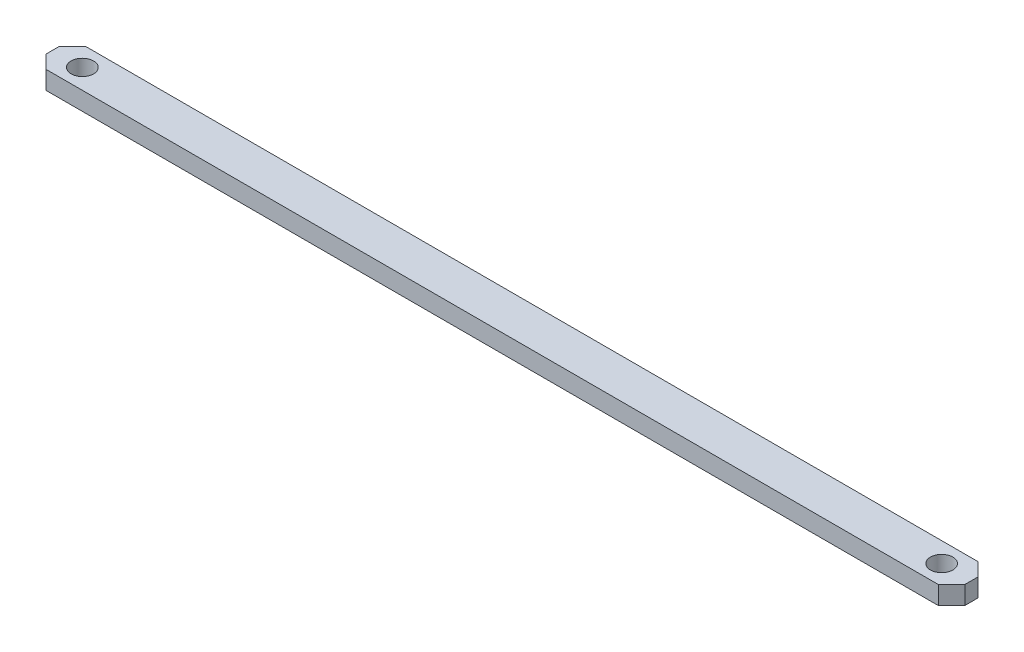
ISO-10303-21;
HEADER;
FILE_DESCRIPTION(('STEP AP214'),'2;1');
FILE_NAME('part.step','',(''),(''),'','','');
FILE_SCHEMA(('AUTOMOTIVE_DESIGN { 1 0 10303 214 1 1 1 1 }'));
ENDSEC;
DATA;
#1=APPLICATION_CONTEXT('core data for automotive mechanical design processes');
#2=APPLICATION_PROTOCOL_DEFINITION('international standard','automotive_design',2000,#1);
#3=PRODUCT_CONTEXT('',#1,'mechanical');
#4=PRODUCT('Part','Part','',(#3));
#5=PRODUCT_RELATED_PRODUCT_CATEGORY('part','',(#4));
#6=PRODUCT_DEFINITION_FORMATION('','',#4);
#7=PRODUCT_DEFINITION_CONTEXT('part definition',#1,'design');
#8=PRODUCT_DEFINITION('design','',#6,#7);
#9=PRODUCT_DEFINITION_SHAPE('','',#8);
#10=(LENGTH_UNIT() NAMED_UNIT(*) SI_UNIT(.MILLI.,.METRE.));
#11=(NAMED_UNIT(*) PLANE_ANGLE_UNIT() SI_UNIT($,.RADIAN.));
#12=(NAMED_UNIT(*) SI_UNIT($,.STERADIAN.) SOLID_ANGLE_UNIT());
#13=UNCERTAINTY_MEASURE_WITH_UNIT(LENGTH_MEASURE(1.E-05),#10,'distance_accuracy_value','');
#14=(GEOMETRIC_REPRESENTATION_CONTEXT(3) GLOBAL_UNCERTAINTY_ASSIGNED_CONTEXT((#13)) GLOBAL_UNIT_ASSIGNED_CONTEXT((#10,
#11,#12)) REPRESENTATION_CONTEXT('',''));
#15=CARTESIAN_POINT('',(0.,0.,0.));
#16=DIRECTION('',(0.,0.,1.));
#17=DIRECTION('',(1.,0.,0.));
#18=AXIS2_PLACEMENT_3D('',#15,#16,#17);
#19=CARTESIAN_POINT('',(69.5,1.38,-3.));
#20=DIRECTION('',(-1.,0.,0.));
#21=DIRECTION('',(0.,0.,1.));
#22=AXIS2_PLACEMENT_3D('',#19,#20,#21);
#23=PLANE('',#22);
#24=DIRECTION('',(0.,0.,-1.));
#25=VECTOR('',#24,1.);
#26=CARTESIAN_POINT('',(69.5,-1.38,-3.));
#27=LINE('',#26,#25);
#28=CARTESIAN_POINT('',(69.5,-1.38,0.999999999999971));
#29=VERTEX_POINT('',#28);
#30=CARTESIAN_POINT('',(69.5,-1.38,-0.999999999999998));
#31=VERTEX_POINT('',#30);
#32=EDGE_CURVE('E168',#29,#31,#27,.T.);
#33=ORIENTED_EDGE('',*,*,#32,.T.);
#34=DIRECTION('',(0.,1.,0.));
#35=VECTOR('',#34,1.);
#36=CARTESIAN_POINT('',(69.5,1.38,-0.999999999999998));
#37=LINE('',#36,#35);
#38=CARTESIAN_POINT('',(69.5,1.38,-0.999999999999998));
#39=VERTEX_POINT('',#38);
#40=EDGE_CURVE('E11',#31,#39,#37,.T.);
#41=ORIENTED_EDGE('',*,*,#40,.T.);
#42=DIRECTION('',(0.,0.,-1.));
#43=VECTOR('',#42,1.);
#44=CARTESIAN_POINT('',(69.5,1.38,-3.));
#45=LINE('',#44,#43);
#46=CARTESIAN_POINT('',(69.5,1.38,0.999999999999971));
#47=VERTEX_POINT('',#46);
#48=EDGE_CURVE('E136',#47,#39,#45,.T.);
#49=ORIENTED_EDGE('',*,*,#48,.F.);
#50=DIRECTION('',(0.,-1.,0.));
#51=VECTOR('',#50,1.);
#52=CARTESIAN_POINT('',(69.5,1.38,0.999999999999971));
#53=LINE('',#52,#51);
#54=EDGE_CURVE('E52',#47,#29,#53,.T.);
#55=ORIENTED_EDGE('',*,*,#54,.T.);
#56=EDGE_LOOP('',(#33,#41,#49,#55));
#57=FACE_BOUND('',#56,.T.);
#58=ADVANCED_FACE('F43',(#57),#23,.F.);
#59=CARTESIAN_POINT('',(-69.5,1.38,-3.));
#60=DIRECTION('',(0.,0.,1.));
#61=DIRECTION('',(1.,0.,0.));
#62=AXIS2_PLACEMENT_3D('',#59,#60,#61);
#63=PLANE('',#62);
#64=DIRECTION('',(-1.,0.,0.));
#65=VECTOR('',#64,1.);
#66=CARTESIAN_POINT('',(-69.5,-1.38,-3.));
#67=LINE('',#66,#65);
#68=CARTESIAN_POINT('',(67.5,-1.38,-3.));
#69=VERTEX_POINT('',#68);
#70=CARTESIAN_POINT('',(-67.4999999999999,-1.38,-3.));
#71=VERTEX_POINT('',#70);
#72=EDGE_CURVE('E141',#69,#71,#67,.T.);
#73=ORIENTED_EDGE('',*,*,#72,.T.);
#74=DIRECTION('',(0.,1.,0.));
#75=VECTOR('',#74,1.);
#76=CARTESIAN_POINT('',(-67.4999999999999,1.38,-3.));
#77=LINE('',#76,#75);
#78=CARTESIAN_POINT('',(-67.4999999999999,1.38,-3.));
#79=VERTEX_POINT('',#78);
#80=EDGE_CURVE('E59',#71,#79,#77,.T.);
#81=ORIENTED_EDGE('',*,*,#80,.T.);
#82=DIRECTION('',(-1.,0.,0.));
#83=VECTOR('',#82,1.);
#84=CARTESIAN_POINT('',(-69.5,1.38,-3.));
#85=LINE('',#84,#83);
#86=CARTESIAN_POINT('',(67.5,1.38,-3.));
#87=VERTEX_POINT('',#86);
#88=EDGE_CURVE('E139',#87,#79,#85,.T.);
#89=ORIENTED_EDGE('',*,*,#88,.F.);
#90=DIRECTION('',(0.,-1.,0.));
#91=VECTOR('',#90,1.);
#92=CARTESIAN_POINT('',(67.5,1.38,-3.));
#93=LINE('',#92,#91);
#94=EDGE_CURVE('E160',#87,#69,#93,.T.);
#95=ORIENTED_EDGE('',*,*,#94,.T.);
#96=EDGE_LOOP('',(#73,#81,#89,#95));
#97=FACE_BOUND('',#96,.T.);
#98=ADVANCED_FACE('F209',(#97),#63,.F.);
#99=CARTESIAN_POINT('',(-69.5,1.38,-3.));
#100=DIRECTION('',(1.,0.,0.));
#101=DIRECTION('',(0.,0.,-1.));
#102=AXIS2_PLACEMENT_3D('',#99,#100,#101);
#103=PLANE('',#102);
#104=DIRECTION('',(0.,0.,1.));
#105=VECTOR('',#104,1.);
#106=CARTESIAN_POINT('',(-69.5,-1.38,-3.));
#107=LINE('',#106,#105);
#108=CARTESIAN_POINT('',(-69.5,-1.38,-0.99999999999997));
#109=VERTEX_POINT('',#108);
#110=CARTESIAN_POINT('',(-69.5,-1.38,0.999999999999985));
#111=VERTEX_POINT('',#110);
#112=EDGE_CURVE('E137',#109,#111,#107,.T.);
#113=ORIENTED_EDGE('',*,*,#112,.T.);
#114=DIRECTION('',(0.,1.,0.));
#115=VECTOR('',#114,1.);
#116=CARTESIAN_POINT('',(-69.5,1.38,0.999999999999985));
#117=LINE('',#116,#115);
#118=CARTESIAN_POINT('',(-69.5,1.38,0.999999999999985));
#119=VERTEX_POINT('',#118);
#120=EDGE_CURVE('E115',#111,#119,#117,.T.);
#121=ORIENTED_EDGE('',*,*,#120,.T.);
#122=DIRECTION('',(0.,0.,1.));
#123=VECTOR('',#122,1.);
#124=CARTESIAN_POINT('',(-69.5,1.38,-3.));
#125=LINE('',#124,#123);
#126=CARTESIAN_POINT('',(-69.5,1.38,-0.99999999999997));
#127=VERTEX_POINT('',#126);
#128=EDGE_CURVE('E180',#127,#119,#125,.T.);
#129=ORIENTED_EDGE('',*,*,#128,.F.);
#130=DIRECTION('',(0.,-1.,0.));
#131=VECTOR('',#130,1.);
#132=CARTESIAN_POINT('',(-69.5,1.38,-0.99999999999997));
#133=LINE('',#132,#131);
#134=EDGE_CURVE('E120',#127,#109,#133,.T.);
#135=ORIENTED_EDGE('',*,*,#134,.T.);
#136=EDGE_LOOP('',(#113,#121,#129,#135));
#137=FACE_BOUND('',#136,.T.);
#138=ADVANCED_FACE('F214',(#137),#103,.F.);
#139=CARTESIAN_POINT('',(-69.5,1.38,3.));
#140=DIRECTION('',(0.,0.,-1.));
#141=DIRECTION('',(-1.,0.,0.));
#142=AXIS2_PLACEMENT_3D('',#139,#140,#141);
#143=PLANE('',#142);
#144=DIRECTION('',(1.,0.,0.));
#145=VECTOR('',#144,1.);
#146=CARTESIAN_POINT('',(-69.5,1.38,3.));
#147=LINE('',#146,#145);
#148=CARTESIAN_POINT('',(-67.5,1.38,3.));
#149=VERTEX_POINT('',#148);
#150=CARTESIAN_POINT('',(67.5,1.38,3.));
#151=VERTEX_POINT('',#150);
#152=EDGE_CURVE('E130',#149,#151,#147,.T.);
#153=ORIENTED_EDGE('',*,*,#152,.F.);
#154=DIRECTION('',(0.,-1.,0.));
#155=VECTOR('',#154,1.);
#156=CARTESIAN_POINT('',(-67.5,1.38,3.));
#157=LINE('',#156,#155);
#158=CARTESIAN_POINT('',(-67.5,-1.38,3.));
#159=VERTEX_POINT('',#158);
#160=EDGE_CURVE('E114',#149,#159,#157,.T.);
#161=ORIENTED_EDGE('',*,*,#160,.T.);
#162=DIRECTION('',(1.,0.,0.));
#163=VECTOR('',#162,1.);
#164=CARTESIAN_POINT('',(-69.5,-1.38,3.));
#165=LINE('',#164,#163);
#166=CARTESIAN_POINT('',(67.5,-1.38,3.));
#167=VERTEX_POINT('',#166);
#168=EDGE_CURVE('E127',#159,#167,#165,.T.);
#169=ORIENTED_EDGE('',*,*,#168,.T.);
#170=DIRECTION('',(0.,1.,0.));
#171=VECTOR('',#170,1.);
#172=CARTESIAN_POINT('',(67.5,1.38,3.));
#173=LINE('',#172,#171);
#174=EDGE_CURVE('E132',#167,#151,#173,.T.);
#175=ORIENTED_EDGE('',*,*,#174,.T.);
#176=EDGE_LOOP('',(#153,#161,#169,#175));
#177=FACE_BOUND('',#176,.T.);
#178=ADVANCED_FACE('F126',(#177),#143,.F.);
#179=CARTESIAN_POINT('',(0.,1.38,0.));
#180=DIRECTION('',(0.,1.,0.));
#181=DIRECTION('',(0.,0.,1.));
#182=AXIS2_PLACEMENT_3D('',#179,#180,#181);
#183=PLANE('',#182);
#184=CARTESIAN_POINT('',(65.,1.38,0.));
#185=DIRECTION('',(0.,1.,0.));
#186=DIRECTION('',(0.,0.,1.));
#187=AXIS2_PLACEMENT_3D('',#184,#185,#186);
#188=CIRCLE('',#187,1.7);
#189=CARTESIAN_POINT('',(65.,1.38,1.7));
#190=VERTEX_POINT('',#189);
#191=EDGE_CURVE('E173',#190,#190,#188,.T.);
#192=ORIENTED_EDGE('',*,*,#191,.F.);
#193=EDGE_LOOP('',(#192));
#194=FACE_BOUND('',#193,.T.);
#195=CARTESIAN_POINT('',(-65.,1.38,0.));
#196=DIRECTION('',(0.,1.,0.));
#197=DIRECTION('',(0.,0.,1.));
#198=AXIS2_PLACEMENT_3D('',#195,#196,#197);
#199=CIRCLE('',#198,1.7);
#200=CARTESIAN_POINT('',(-65.,1.38,1.7));
#201=VERTEX_POINT('',#200);
#202=EDGE_CURVE('E176',#201,#201,#199,.T.);
#203=ORIENTED_EDGE('',*,*,#202,.F.);
#204=EDGE_LOOP('',(#203));
#205=FACE_BOUND('',#204,.T.);
#206=ORIENTED_EDGE('',*,*,#128,.T.);
#207=DIRECTION('',(-0.707106781186545,0.,-0.70710678118655));
#208=VECTOR('',#207,1.);
#209=CARTESIAN_POINT('',(-35.2500000000002,1.38,35.25));
#210=LINE('',#209,#208);
#211=EDGE_CURVE('E158',#119,#149,#210,.F.);
#212=ORIENTED_EDGE('',*,*,#211,.T.);
#213=ORIENTED_EDGE('',*,*,#152,.T.);
#214=DIRECTION('',(-0.707106781186552,0.,0.707106781186543));
#215=VECTOR('',#214,1.);
#216=CARTESIAN_POINT('',(35.2499999999995,1.38,35.25));
#217=LINE('',#216,#215);
#218=EDGE_CURVE('E153',#151,#47,#217,.F.);
#219=ORIENTED_EDGE('',*,*,#218,.T.);
#220=ORIENTED_EDGE('',*,*,#48,.T.);
#221=DIRECTION('',(0.707106781186543,0.,0.707106781186552));
#222=VECTOR('',#221,1.);
#223=CARTESIAN_POINT('',(35.2500000000005,1.38,-35.25));
#224=LINE('',#223,#222);
#225=EDGE_CURVE('E66',#39,#87,#224,.F.);
#226=ORIENTED_EDGE('',*,*,#225,.T.);
#227=ORIENTED_EDGE('',*,*,#88,.T.);
#228=DIRECTION('',(0.70710678118655,0.,-0.707106781186545));
#229=VECTOR('',#228,1.);
#230=CARTESIAN_POINT('',(-35.2499999999997,1.38,-35.25));
#231=LINE('',#230,#229);
#232=EDGE_CURVE('E156',#79,#127,#231,.F.);
#233=ORIENTED_EDGE('',*,*,#232,.T.);
#234=EDGE_LOOP('',(#206,#212,#213,#219,#220,#226,#227,#233));
#235=FACE_BOUND('',#234,.T.);
#236=ADVANCED_FACE('F240',(#194,#205,#235),#183,.T.);
#237=CARTESIAN_POINT('',(0.,-1.38,0.));
#238=DIRECTION('',(0.,1.,0.));
#239=DIRECTION('',(0.,0.,1.));
#240=AXIS2_PLACEMENT_3D('',#237,#238,#239);
#241=PLANE('',#240);
#242=CARTESIAN_POINT('',(65.,-1.38,0.));
#243=DIRECTION('',(0.,1.,0.));
#244=DIRECTION('',(0.,0.,1.));
#245=AXIS2_PLACEMENT_3D('',#242,#243,#244);
#246=CIRCLE('',#245,1.7);
#247=CARTESIAN_POINT('',(65.,-1.38,1.7));
#248=VERTEX_POINT('',#247);
#249=EDGE_CURVE('E186',#248,#248,#246,.T.);
#250=ORIENTED_EDGE('',*,*,#249,.T.);
#251=EDGE_LOOP('',(#250));
#252=FACE_BOUND('',#251,.T.);
#253=CARTESIAN_POINT('',(-65.,-1.38,0.));
#254=DIRECTION('',(0.,1.,0.));
#255=DIRECTION('',(0.,0.,-1.));
#256=AXIS2_PLACEMENT_3D('',#253,#254,#255);
#257=CIRCLE('',#256,1.7);
#258=CARTESIAN_POINT('',(-65.,-1.38,-1.7));
#259=VERTEX_POINT('',#258);
#260=EDGE_CURVE('E187',#259,#259,#257,.T.);
#261=ORIENTED_EDGE('',*,*,#260,.T.);
#262=EDGE_LOOP('',(#261));
#263=FACE_BOUND('',#262,.T.);
#264=ORIENTED_EDGE('',*,*,#168,.F.);
#265=DIRECTION('',(0.707106781186545,0.,0.70710678118655));
#266=VECTOR('',#265,1.);
#267=CARTESIAN_POINT('',(-67.5,-1.38,3.));
#268=LINE('',#267,#266);
#269=EDGE_CURVE('E110',#159,#111,#268,.F.);
#270=ORIENTED_EDGE('',*,*,#269,.T.);
#271=ORIENTED_EDGE('',*,*,#112,.F.);
#272=DIRECTION('',(-0.70710678118655,0.,0.707106781186545));
#273=VECTOR('',#272,1.);
#274=CARTESIAN_POINT('',(-69.5,-1.38,-0.99999999999997));
#275=LINE('',#274,#273);
#276=EDGE_CURVE('E121',#109,#71,#275,.F.);
#277=ORIENTED_EDGE('',*,*,#276,.T.);
#278=ORIENTED_EDGE('',*,*,#72,.F.);
#279=DIRECTION('',(-0.707106781186543,0.,-0.707106781186552));
#280=VECTOR('',#279,1.);
#281=CARTESIAN_POINT('',(67.5,-1.38,-3.));
#282=LINE('',#281,#280);
#283=EDGE_CURVE('E147',#69,#31,#282,.F.);
#284=ORIENTED_EDGE('',*,*,#283,.T.);
#285=ORIENTED_EDGE('',*,*,#32,.F.);
#286=DIRECTION('',(0.707106781186552,0.,-0.707106781186543));
#287=VECTOR('',#286,1.);
#288=CARTESIAN_POINT('',(69.5,-1.38,0.999999999999971));
#289=LINE('',#288,#287);
#290=EDGE_CURVE('E131',#29,#167,#289,.F.);
#291=ORIENTED_EDGE('',*,*,#290,.T.);
#292=EDGE_LOOP('',(#264,#270,#271,#277,#278,#284,#285,#291));
#293=FACE_BOUND('',#292,.T.);
#294=ADVANCED_FACE('F134',(#252,#263,#293),#241,.F.);
#295=CARTESIAN_POINT('',(-65.,-1.38,0.));
#296=DIRECTION('',(0.,1.,0.));
#297=DIRECTION('',(0.,0.,1.));
#298=AXIS2_PLACEMENT_3D('',#295,#296,#297);
#299=CYLINDRICAL_SURFACE('',#298,1.7);
#300=ORIENTED_EDGE('',*,*,#202,.T.);
#301=EDGE_LOOP('',(#300));
#302=FACE_BOUND('',#301,.T.);
#303=ORIENTED_EDGE('',*,*,#260,.F.);
#304=EDGE_LOOP('',(#303));
#305=FACE_BOUND('',#304,.T.);
#306=ADVANCED_FACE('F197',(#302,#305),#299,.F.);
#307=CARTESIAN_POINT('',(65.,-1.38,0.));
#308=DIRECTION('',(0.,1.,0.));
#309=DIRECTION('',(0.,0.,1.));
#310=AXIS2_PLACEMENT_3D('',#307,#308,#309);
#311=CYLINDRICAL_SURFACE('',#310,1.7);
#312=ORIENTED_EDGE('',*,*,#191,.T.);
#313=EDGE_LOOP('',(#312));
#314=FACE_BOUND('',#313,.T.);
#315=ORIENTED_EDGE('',*,*,#249,.F.);
#316=EDGE_LOOP('',(#315));
#317=FACE_BOUND('',#316,.T.);
#318=ADVANCED_FACE('F195',(#314,#317),#311,.F.);
#319=CARTESIAN_POINT('',(-67.5,1.38,3.));
#320=DIRECTION('',(0.70710678118655,0.,-0.707106781186545));
#321=DIRECTION('',(0.,-1.,0.));
#322=AXIS2_PLACEMENT_3D('',#319,#320,#321);
#323=PLANE('',#322);
#324=ORIENTED_EDGE('',*,*,#211,.F.);
#325=ORIENTED_EDGE('',*,*,#120,.F.);
#326=ORIENTED_EDGE('',*,*,#269,.F.);
#327=ORIENTED_EDGE('',*,*,#160,.F.);
#328=EDGE_LOOP('',(#324,#325,#326,#327));
#329=FACE_BOUND('',#328,.T.);
#330=ADVANCED_FACE('F113',(#329),#323,.F.);
#331=CARTESIAN_POINT('',(-69.5,1.38,-0.99999999999997));
#332=DIRECTION('',(0.707106781186545,0.,0.70710678118655));
#333=DIRECTION('',(0.,-1.,0.));
#334=AXIS2_PLACEMENT_3D('',#331,#332,#333);
#335=PLANE('',#334);
#336=ORIENTED_EDGE('',*,*,#232,.F.);
#337=ORIENTED_EDGE('',*,*,#80,.F.);
#338=ORIENTED_EDGE('',*,*,#276,.F.);
#339=ORIENTED_EDGE('',*,*,#134,.F.);
#340=EDGE_LOOP('',(#336,#337,#338,#339));
#341=FACE_BOUND('',#340,.T.);
#342=ADVANCED_FACE('F204',(#341),#335,.F.);
#343=CARTESIAN_POINT('',(67.5,1.38,-3.));
#344=DIRECTION('',(-0.707106781186552,0.,0.707106781186543));
#345=DIRECTION('',(0.,-1.,0.));
#346=AXIS2_PLACEMENT_3D('',#343,#344,#345);
#347=PLANE('',#346);
#348=ORIENTED_EDGE('',*,*,#225,.F.);
#349=ORIENTED_EDGE('',*,*,#40,.F.);
#350=ORIENTED_EDGE('',*,*,#283,.F.);
#351=ORIENTED_EDGE('',*,*,#94,.F.);
#352=EDGE_LOOP('',(#348,#349,#350,#351));
#353=FACE_BOUND('',#352,.T.);
#354=ADVANCED_FACE('F226',(#353),#347,.F.);
#355=CARTESIAN_POINT('',(69.5,1.38,0.999999999999971));
#356=DIRECTION('',(-0.707106781186543,0.,-0.707106781186552));
#357=DIRECTION('',(0.,-1.,0.));
#358=AXIS2_PLACEMENT_3D('',#355,#356,#357);
#359=PLANE('',#358);
#360=ORIENTED_EDGE('',*,*,#218,.F.);
#361=ORIENTED_EDGE('',*,*,#174,.F.);
#362=ORIENTED_EDGE('',*,*,#290,.F.);
#363=ORIENTED_EDGE('',*,*,#54,.F.);
#364=EDGE_LOOP('',(#360,#361,#362,#363));
#365=FACE_BOUND('',#364,.T.);
#366=ADVANCED_FACE('F46',(#365),#359,.F.);
#367=CLOSED_SHELL('',(#58,#98,#138,#178,#236,#294,#306,#318,#330,#342,#354,#366));
#368=MANIFOLD_SOLID_BREP('B2',#367);
#369=ADVANCED_BREP_SHAPE_REPRESENTATION('',(#18,#368),#14);
#370=SHAPE_DEFINITION_REPRESENTATION(#9,#369);
ENDSEC;
END-ISO-10303-21;
